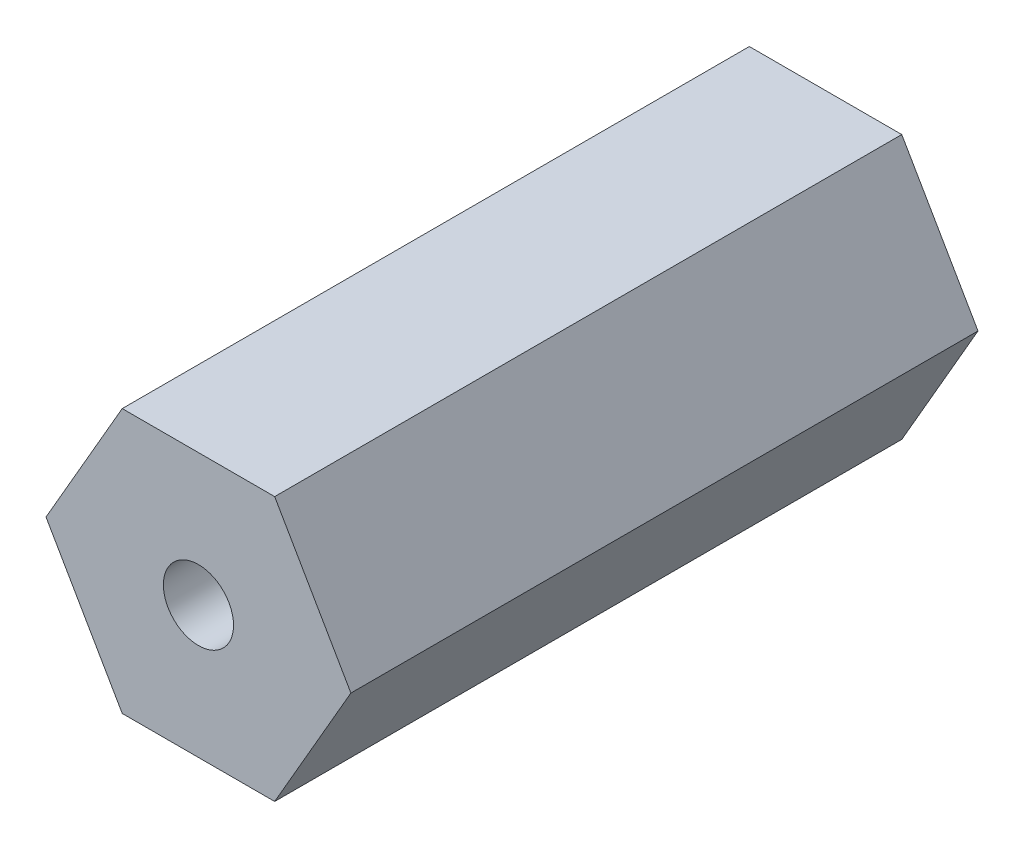
ISO-10303-21;
HEADER;
FILE_DESCRIPTION(('STEP AP214'),'2;1');
FILE_NAME('part.step','',(''),(''),'','','');
FILE_SCHEMA(('AUTOMOTIVE_DESIGN { 1 0 10303 214 1 1 1 1 }'));
ENDSEC;
DATA;
#1=APPLICATION_CONTEXT('core data for automotive mechanical design processes');
#2=APPLICATION_PROTOCOL_DEFINITION('international standard','automotive_design',2000,#1);
#3=PRODUCT_CONTEXT('',#1,'mechanical');
#4=PRODUCT('Part','Part','',(#3));
#5=PRODUCT_RELATED_PRODUCT_CATEGORY('part','',(#4));
#6=PRODUCT_DEFINITION_FORMATION('','',#4);
#7=PRODUCT_DEFINITION_CONTEXT('part definition',#1,'design');
#8=PRODUCT_DEFINITION('design','',#6,#7);
#9=PRODUCT_DEFINITION_SHAPE('','',#8);
#10=(LENGTH_UNIT() NAMED_UNIT(*) SI_UNIT(.MILLI.,.METRE.));
#11=(NAMED_UNIT(*) PLANE_ANGLE_UNIT() SI_UNIT($,.RADIAN.));
#12=(NAMED_UNIT(*) SI_UNIT($,.STERADIAN.) SOLID_ANGLE_UNIT());
#13=UNCERTAINTY_MEASURE_WITH_UNIT(LENGTH_MEASURE(1.E-05),#10,'distance_accuracy_value','');
#14=(GEOMETRIC_REPRESENTATION_CONTEXT(3) GLOBAL_UNCERTAINTY_ASSIGNED_CONTEXT((#13)) GLOBAL_UNIT_ASSIGNED_CONTEXT((#10,
#11,#12)) REPRESENTATION_CONTEXT('',''));
#15=CARTESIAN_POINT('',(0.,0.,0.));
#16=DIRECTION('',(0.,0.,1.));
#17=DIRECTION('',(1.,0.,0.));
#18=AXIS2_PLACEMENT_3D('',#15,#16,#17);
#19=CARTESIAN_POINT('',(4.39940905122495,2.54,24.13));
#20=DIRECTION('',(-0.866025403784438,-0.5,0.));
#21=DIRECTION('',(0.5,-0.866025403784439,0.));
#22=AXIS2_PLACEMENT_3D('',#19,#20,#21);
#23=PLANE('',#22);
#24=DIRECTION('',(-0.5,0.866025403784439,0.));
#25=VECTOR('',#24,1.);
#26=CARTESIAN_POINT('',(4.39940905122495,2.54,0.));
#27=LINE('',#26,#25);
#28=CARTESIAN_POINT('',(5.8658787349666,0.,0.));
#29=VERTEX_POINT('',#28);
#30=CARTESIAN_POINT('',(2.9329393674833,5.08,0.));
#31=VERTEX_POINT('',#30);
#32=EDGE_CURVE('E119',#29,#31,#27,.T.);
#33=ORIENTED_EDGE('',*,*,#32,.T.);
#34=DIRECTION('',(0.,0.,-1.));
#35=VECTOR('',#34,1.);
#36=CARTESIAN_POINT('',(2.9329393674833,5.08,24.13));
#37=LINE('',#36,#35);
#38=CARTESIAN_POINT('',(2.9329393674833,5.08,24.13));
#39=VERTEX_POINT('',#38);
#40=EDGE_CURVE('E11',#39,#31,#37,.T.);
#41=ORIENTED_EDGE('',*,*,#40,.F.);
#42=DIRECTION('',(-0.5,0.866025403784439,0.));
#43=VECTOR('',#42,1.);
#44=CARTESIAN_POINT('',(4.39940905122495,2.54,24.13));
#45=LINE('',#44,#43);
#46=CARTESIAN_POINT('',(5.8658787349666,0.,24.13));
#47=VERTEX_POINT('',#46);
#48=EDGE_CURVE('E130',#47,#39,#45,.T.);
#49=ORIENTED_EDGE('',*,*,#48,.F.);
#50=DIRECTION('',(0.,0.,-1.));
#51=VECTOR('',#50,1.);
#52=CARTESIAN_POINT('',(5.8658787349666,0.,24.13));
#53=LINE('',#52,#51);
#54=EDGE_CURVE('E115',#47,#29,#53,.T.);
#55=ORIENTED_EDGE('',*,*,#54,.T.);
#56=EDGE_LOOP('',(#33,#41,#49,#55));
#57=FACE_BOUND('',#56,.T.);
#58=ADVANCED_FACE('F35',(#57),#23,.F.);
#59=CARTESIAN_POINT('',(0.,5.08,24.13));
#60=DIRECTION('',(0.,-1.,0.));
#61=DIRECTION('',(1.,0.,0.));
#62=AXIS2_PLACEMENT_3D('',#59,#60,#61);
#63=PLANE('',#62);
#64=DIRECTION('',(-1.,0.,0.));
#65=VECTOR('',#64,1.);
#66=CARTESIAN_POINT('',(0.,5.08,0.));
#67=LINE('',#66,#65);
#68=CARTESIAN_POINT('',(-2.9329393674833,5.08,0.));
#69=VERTEX_POINT('',#68);
#70=EDGE_CURVE('E122',#31,#69,#67,.T.);
#71=ORIENTED_EDGE('',*,*,#70,.T.);
#72=DIRECTION('',(0.,0.,-1.));
#73=VECTOR('',#72,1.);
#74=CARTESIAN_POINT('',(-2.9329393674833,5.08,24.13));
#75=LINE('',#74,#73);
#76=CARTESIAN_POINT('',(-2.9329393674833,5.08,24.13));
#77=VERTEX_POINT('',#76);
#78=EDGE_CURVE('E43',#77,#69,#75,.T.);
#79=ORIENTED_EDGE('',*,*,#78,.F.);
#80=DIRECTION('',(-1.,0.,0.));
#81=VECTOR('',#80,1.);
#82=CARTESIAN_POINT('',(0.,5.08,24.13));
#83=LINE('',#82,#81);
#84=EDGE_CURVE('E88',#39,#77,#83,.T.);
#85=ORIENTED_EDGE('',*,*,#84,.F.);
#86=ORIENTED_EDGE('',*,*,#40,.T.);
#87=EDGE_LOOP('',(#71,#79,#85,#86));
#88=FACE_BOUND('',#87,.T.);
#89=ADVANCED_FACE('F155',(#88),#63,.F.);
#90=CARTESIAN_POINT('',(-4.39940905122495,2.54,24.13));
#91=DIRECTION('',(0.866025403784439,-0.5,0.));
#92=DIRECTION('',(0.5,0.866025403784439,0.));
#93=AXIS2_PLACEMENT_3D('',#90,#91,#92);
#94=PLANE('',#93);
#95=DIRECTION('',(-0.5,-0.866025403784439,0.));
#96=VECTOR('',#95,1.);
#97=CARTESIAN_POINT('',(-4.39940905122495,2.54,0.));
#98=LINE('',#97,#96);
#99=CARTESIAN_POINT('',(-5.8658787349666,0.,0.));
#100=VERTEX_POINT('',#99);
#101=EDGE_CURVE('E125',#69,#100,#98,.T.);
#102=ORIENTED_EDGE('',*,*,#101,.T.);
#103=DIRECTION('',(0.,0.,-1.));
#104=VECTOR('',#103,1.);
#105=CARTESIAN_POINT('',(-5.8658787349666,0.,24.13));
#106=LINE('',#105,#104);
#107=CARTESIAN_POINT('',(-5.8658787349666,0.,24.13));
#108=VERTEX_POINT('',#107);
#109=EDGE_CURVE('E110',#108,#100,#106,.T.);
#110=ORIENTED_EDGE('',*,*,#109,.F.);
#111=DIRECTION('',(-0.5,-0.866025403784439,0.));
#112=VECTOR('',#111,1.);
#113=CARTESIAN_POINT('',(-4.39940905122495,2.54,24.13));
#114=LINE('',#113,#112);
#115=EDGE_CURVE('E101',#77,#108,#114,.T.);
#116=ORIENTED_EDGE('',*,*,#115,.F.);
#117=ORIENTED_EDGE('',*,*,#78,.T.);
#118=EDGE_LOOP('',(#102,#110,#116,#117));
#119=FACE_BOUND('',#118,.T.);
#120=ADVANCED_FACE('F136',(#119),#94,.F.);
#121=CARTESIAN_POINT('',(-4.39940905122495,-2.54,24.13));
#122=DIRECTION('',(0.866025403784438,0.5,0.));
#123=DIRECTION('',(-0.5,0.866025403784439,0.));
#124=AXIS2_PLACEMENT_3D('',#121,#122,#123);
#125=PLANE('',#124);
#126=DIRECTION('',(0.5,-0.866025403784439,0.));
#127=VECTOR('',#126,1.);
#128=CARTESIAN_POINT('',(-4.39940905122495,-2.54,0.));
#129=LINE('',#128,#127);
#130=CARTESIAN_POINT('',(-2.9329393674833,-5.08,0.));
#131=VERTEX_POINT('',#130);
#132=EDGE_CURVE('E109',#100,#131,#129,.T.);
#133=ORIENTED_EDGE('',*,*,#132,.T.);
#134=DIRECTION('',(0.,0.,-1.));
#135=VECTOR('',#134,1.);
#136=CARTESIAN_POINT('',(-2.9329393674833,-5.08,24.13));
#137=LINE('',#136,#135);
#138=CARTESIAN_POINT('',(-2.9329393674833,-5.08,24.13));
#139=VERTEX_POINT('',#138);
#140=EDGE_CURVE('E106',#139,#131,#137,.T.);
#141=ORIENTED_EDGE('',*,*,#140,.F.);
#142=DIRECTION('',(0.5,-0.866025403784439,0.));
#143=VECTOR('',#142,1.);
#144=CARTESIAN_POINT('',(-4.39940905122495,-2.54,24.13));
#145=LINE('',#144,#143);
#146=EDGE_CURVE('E95',#108,#139,#145,.T.);
#147=ORIENTED_EDGE('',*,*,#146,.F.);
#148=ORIENTED_EDGE('',*,*,#109,.T.);
#149=EDGE_LOOP('',(#133,#141,#147,#148));
#150=FACE_BOUND('',#149,.T.);
#151=ADVANCED_FACE('F107',(#150),#125,.F.);
#152=CARTESIAN_POINT('',(0.,-5.08,24.13));
#153=DIRECTION('',(0.,1.,0.));
#154=DIRECTION('',(0.,0.,1.));
#155=AXIS2_PLACEMENT_3D('',#152,#153,#154);
#156=PLANE('',#155);
#157=DIRECTION('',(1.,0.,0.));
#158=VECTOR('',#157,1.);
#159=CARTESIAN_POINT('',(0.,-5.08,0.));
#160=LINE('',#159,#158);
#161=CARTESIAN_POINT('',(2.9329393674833,-5.08,0.));
#162=VERTEX_POINT('',#161);
#163=EDGE_CURVE('E74',#131,#162,#160,.T.);
#164=ORIENTED_EDGE('',*,*,#163,.T.);
#165=DIRECTION('',(0.,0.,-1.));
#166=VECTOR('',#165,1.);
#167=CARTESIAN_POINT('',(2.9329393674833,-5.08,24.13));
#168=LINE('',#167,#166);
#169=CARTESIAN_POINT('',(2.9329393674833,-5.08,24.13));
#170=VERTEX_POINT('',#169);
#171=EDGE_CURVE('E111',#170,#162,#168,.T.);
#172=ORIENTED_EDGE('',*,*,#171,.F.);
#173=DIRECTION('',(1.,0.,0.));
#174=VECTOR('',#173,1.);
#175=CARTESIAN_POINT('',(0.,-5.08,24.13));
#176=LINE('',#175,#174);
#177=EDGE_CURVE('E99',#139,#170,#176,.T.);
#178=ORIENTED_EDGE('',*,*,#177,.F.);
#179=ORIENTED_EDGE('',*,*,#140,.T.);
#180=EDGE_LOOP('',(#164,#172,#178,#179));
#181=FACE_BOUND('',#180,.T.);
#182=ADVANCED_FACE('F113',(#181),#156,.F.);
#183=CARTESIAN_POINT('',(4.39940905122495,-2.54,24.13));
#184=DIRECTION('',(-0.866025403784439,0.5,0.));
#185=DIRECTION('',(-0.5,-0.866025403784439,0.));
#186=AXIS2_PLACEMENT_3D('',#183,#184,#185);
#187=PLANE('',#186);
#188=DIRECTION('',(0.5,0.866025403784439,0.));
#189=VECTOR('',#188,1.);
#190=CARTESIAN_POINT('',(4.39940905122495,-2.54,0.));
#191=LINE('',#190,#189);
#192=EDGE_CURVE('E80',#162,#29,#191,.T.);
#193=ORIENTED_EDGE('',*,*,#192,.T.);
#194=ORIENTED_EDGE('',*,*,#54,.F.);
#195=DIRECTION('',(0.5,0.866025403784439,0.));
#196=VECTOR('',#195,1.);
#197=CARTESIAN_POINT('',(4.39940905122495,-2.54,24.13));
#198=LINE('',#197,#196);
#199=EDGE_CURVE('E51',#170,#47,#198,.T.);
#200=ORIENTED_EDGE('',*,*,#199,.F.);
#201=ORIENTED_EDGE('',*,*,#171,.T.);
#202=EDGE_LOOP('',(#193,#194,#200,#201));
#203=FACE_BOUND('',#202,.T.);
#204=ADVANCED_FACE('F143',(#203),#187,.F.);
#205=CARTESIAN_POINT('',(0.,0.,24.13));
#206=DIRECTION('',(0.,0.,1.));
#207=DIRECTION('',(1.,0.,0.));
#208=AXIS2_PLACEMENT_3D('',#205,#206,#207);
#209=PLANE('',#208);
#210=CARTESIAN_POINT('',(0.,0.,24.13));
#211=DIRECTION('',(0.,0.,1.));
#212=DIRECTION('',(1.,0.,0.));
#213=AXIS2_PLACEMENT_3D('',#210,#211,#212);
#214=CIRCLE('',#213,1.34999999999999);
#215=CARTESIAN_POINT('',(1.34999999999999,0.,24.13));
#216=VERTEX_POINT('',#215);
#217=EDGE_CURVE('E214',#216,#216,#214,.T.);
#218=ORIENTED_EDGE('',*,*,#217,.F.);
#219=EDGE_LOOP('',(#218));
#220=FACE_BOUND('',#219,.T.);
#221=ORIENTED_EDGE('',*,*,#48,.T.);
#222=ORIENTED_EDGE('',*,*,#84,.T.);
#223=ORIENTED_EDGE('',*,*,#115,.T.);
#224=ORIENTED_EDGE('',*,*,#146,.T.);
#225=ORIENTED_EDGE('',*,*,#177,.T.);
#226=ORIENTED_EDGE('',*,*,#199,.T.);
#227=EDGE_LOOP('',(#221,#222,#223,#224,#225,#226));
#228=FACE_BOUND('',#227,.T.);
#229=ADVANCED_FACE('F97',(#220,#228),#209,.T.);
#230=CARTESIAN_POINT('',(0.,0.,0.));
#231=DIRECTION('',(0.,0.,1.));
#232=DIRECTION('',(1.,0.,0.));
#233=AXIS2_PLACEMENT_3D('',#230,#231,#232);
#234=PLANE('',#233);
#235=CARTESIAN_POINT('',(0.,0.,0.));
#236=DIRECTION('',(0.,0.,1.));
#237=DIRECTION('',(1.,0.,0.));
#238=AXIS2_PLACEMENT_3D('',#235,#236,#237);
#239=CIRCLE('',#238,1.34999999999998);
#240=CARTESIAN_POINT('',(1.34999999999998,0.,0.));
#241=VERTEX_POINT('',#240);
#242=EDGE_CURVE('E123',#241,#241,#239,.T.);
#243=ORIENTED_EDGE('',*,*,#242,.T.);
#244=EDGE_LOOP('',(#243));
#245=FACE_BOUND('',#244,.T.);
#246=ORIENTED_EDGE('',*,*,#32,.F.);
#247=ORIENTED_EDGE('',*,*,#192,.F.);
#248=ORIENTED_EDGE('',*,*,#163,.F.);
#249=ORIENTED_EDGE('',*,*,#132,.F.);
#250=ORIENTED_EDGE('',*,*,#101,.F.);
#251=ORIENTED_EDGE('',*,*,#70,.F.);
#252=EDGE_LOOP('',(#246,#247,#248,#249,#250,#251));
#253=FACE_BOUND('',#252,.T.);
#254=ADVANCED_FACE('F139',(#245,#253),#234,.F.);
#255=CARTESIAN_POINT('',(0.,0.,24.13));
#256=DIRECTION('',(0.,0.,1.));
#257=DIRECTION('',(1.,0.,0.));
#258=AXIS2_PLACEMENT_3D('',#255,#256,#257);
#259=CYLINDRICAL_SURFACE('',#258,1.34999999999999);
#260=ORIENTED_EDGE('',*,*,#242,.F.);
#261=EDGE_LOOP('',(#260));
#262=FACE_BOUND('',#261,.T.);
#263=ORIENTED_EDGE('',*,*,#217,.T.);
#264=EDGE_LOOP('',(#263));
#265=FACE_BOUND('',#264,.T.);
#266=ADVANCED_FACE('F195',(#262,#265),#259,.F.);
#267=CLOSED_SHELL('',(#58,#89,#120,#151,#182,#204,#229,#254,#266));
#268=MANIFOLD_SOLID_BREP('B2',#267);
#269=ADVANCED_BREP_SHAPE_REPRESENTATION('',(#18,#268),#14);
#270=SHAPE_DEFINITION_REPRESENTATION(#9,#269);
ENDSEC;
END-ISO-10303-21;
